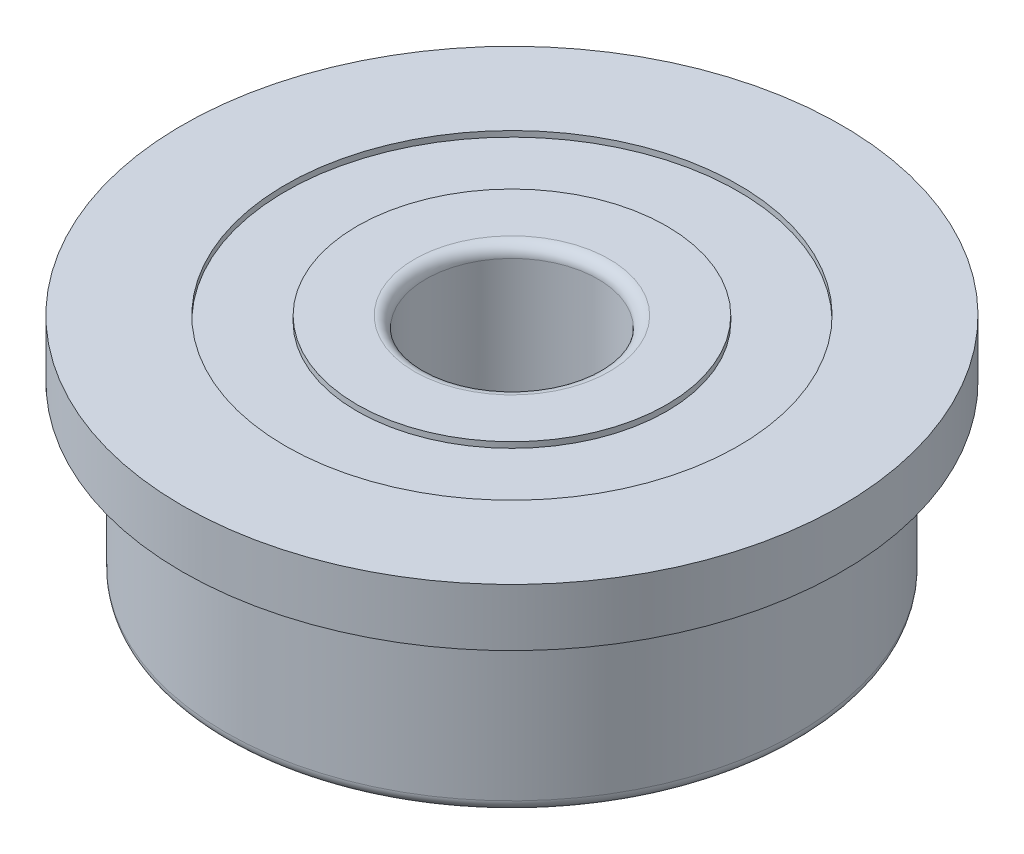
ISO-10303-21;
HEADER;
FILE_DESCRIPTION(('STEP AP214'),'2;1');
FILE_NAME('part.step','',(''),(''),'','','');
FILE_SCHEMA(('AUTOMOTIVE_DESIGN { 1 0 10303 214 1 1 1 1 }'));
ENDSEC;
DATA;
#1=APPLICATION_CONTEXT('core data for automotive mechanical design processes');
#2=APPLICATION_PROTOCOL_DEFINITION('international standard','automotive_design',2000,#1);
#3=PRODUCT_CONTEXT('',#1,'mechanical');
#4=PRODUCT('Part','Part','',(#3));
#5=PRODUCT_RELATED_PRODUCT_CATEGORY('part','',(#4));
#6=PRODUCT_DEFINITION_FORMATION('','',#4);
#7=PRODUCT_DEFINITION_CONTEXT('part definition',#1,'design');
#8=PRODUCT_DEFINITION('design','',#6,#7);
#9=PRODUCT_DEFINITION_SHAPE('','',#8);
#10=(LENGTH_UNIT() NAMED_UNIT(*) SI_UNIT(.MILLI.,.METRE.));
#11=(NAMED_UNIT(*) PLANE_ANGLE_UNIT() SI_UNIT($,.RADIAN.));
#12=(NAMED_UNIT(*) SI_UNIT($,.STERADIAN.) SOLID_ANGLE_UNIT());
#13=UNCERTAINTY_MEASURE_WITH_UNIT(LENGTH_MEASURE(1.E-05),#10,'distance_accuracy_value','');
#14=(GEOMETRIC_REPRESENTATION_CONTEXT(3) GLOBAL_UNCERTAINTY_ASSIGNED_CONTEXT((#13)) GLOBAL_UNIT_ASSIGNED_CONTEXT((#10,
#11,#12)) REPRESENTATION_CONTEXT('',''));
#15=CARTESIAN_POINT('',(0.,0.,0.));
#16=DIRECTION('',(0.,0.,1.));
#17=DIRECTION('',(1.,0.,0.));
#18=AXIS2_PLACEMENT_3D('',#15,#16,#17);
#19=CARTESIAN_POINT('',(0.,-0.2,0.));
#20=DIRECTION('',(0.,1.,0.));
#21=DIRECTION('',(0.,0.,1.));
#22=AXIS2_PLACEMENT_3D('',#19,#20,#21);
#23=TOROIDAL_SURFACE('',#22,1.7,0.2);
#24=CARTESIAN_POINT('',(0.,-0.2,0.));
#25=DIRECTION('',(0.,1.,0.));
#26=DIRECTION('',(0.,0.,1.));
#27=AXIS2_PLACEMENT_3D('',#24,#25,#26);
#28=CIRCLE('',#27,1.5);
#29=CARTESIAN_POINT('',(0.,-0.2,1.5));
#30=VERTEX_POINT('',#29);
#31=EDGE_CURVE('E398',#30,#30,#28,.T.);
#32=ORIENTED_EDGE('',*,*,#31,.F.);
#33=EDGE_LOOP('',(#32));
#34=FACE_BOUND('',#33,.T.);
#35=CARTESIAN_POINT('',(0.,0.,0.));
#36=DIRECTION('',(0.,-1.,0.));
#37=DIRECTION('',(0.,0.,1.));
#38=AXIS2_PLACEMENT_3D('',#35,#36,#37);
#39=CIRCLE('',#38,1.7);
#40=CARTESIAN_POINT('',(0.,0.,1.7));
#41=VERTEX_POINT('',#40);
#42=EDGE_CURVE('E410',#41,#41,#39,.T.);
#43=ORIENTED_EDGE('',*,*,#42,.F.);
#44=EDGE_LOOP('',(#43));
#45=FACE_BOUND('',#44,.T.);
#46=ADVANCED_FACE('F16',(#34,#45),#23,.T.);
#47=CARTESIAN_POINT('',(0.,-3.8,0.));
#48=DIRECTION('',(0.,-1.,0.));
#49=DIRECTION('',(0.,0.,-1.));
#50=AXIS2_PLACEMENT_3D('',#47,#48,#49);
#51=TOROIDAL_SURFACE('',#50,1.7,0.2);
#52=CARTESIAN_POINT('',(0.,-4.,0.));
#53=DIRECTION('',(0.,1.,0.));
#54=DIRECTION('',(0.,0.,-1.));
#55=AXIS2_PLACEMENT_3D('',#52,#53,#54);
#56=CIRCLE('',#55,1.7);
#57=CARTESIAN_POINT('',(0.,-4.,-1.7));
#58=VERTEX_POINT('',#57);
#59=EDGE_CURVE('E11',#58,#58,#56,.T.);
#60=ORIENTED_EDGE('',*,*,#59,.F.);
#61=EDGE_LOOP('',(#60));
#62=FACE_BOUND('',#61,.T.);
#63=CARTESIAN_POINT('',(0.,-3.8,0.));
#64=DIRECTION('',(0.,-1.,0.));
#65=DIRECTION('',(0.,0.,-1.));
#66=AXIS2_PLACEMENT_3D('',#63,#64,#65);
#67=CIRCLE('',#66,1.5);
#68=CARTESIAN_POINT('',(0.,-3.8,-1.5));
#69=VERTEX_POINT('',#68);
#70=EDGE_CURVE('E402',#69,#69,#67,.T.);
#71=ORIENTED_EDGE('',*,*,#70,.F.);
#72=EDGE_LOOP('',(#71));
#73=FACE_BOUND('',#72,.T.);
#74=ADVANCED_FACE('F132',(#62,#73),#51,.T.);
#75=CARTESIAN_POINT('',(0.,-3.8,0.));
#76=DIRECTION('',(0.,-1.,0.));
#77=DIRECTION('',(0.,0.,-1.));
#78=AXIS2_PLACEMENT_3D('',#75,#76,#77);
#79=TOROIDAL_SURFACE('',#78,4.8,0.2);
#80=CARTESIAN_POINT('',(0.,-3.8,0.));
#81=DIRECTION('',(0.,1.,0.));
#82=DIRECTION('',(0.,0.,-1.));
#83=AXIS2_PLACEMENT_3D('',#80,#81,#82);
#84=CIRCLE('',#83,5.);
#85=CARTESIAN_POINT('',(0.,-3.8,-5.));
#86=VERTEX_POINT('',#85);
#87=EDGE_CURVE('E108',#86,#86,#84,.T.);
#88=ORIENTED_EDGE('',*,*,#87,.F.);
#89=EDGE_LOOP('',(#88));
#90=FACE_BOUND('',#89,.T.);
#91=CARTESIAN_POINT('',(0.,-4.,0.));
#92=DIRECTION('',(0.,-1.,0.));
#93=DIRECTION('',(0.,0.,-1.));
#94=AXIS2_PLACEMENT_3D('',#91,#92,#93);
#95=CIRCLE('',#94,4.8);
#96=CARTESIAN_POINT('',(0.,-4.,-4.8));
#97=VERTEX_POINT('',#96);
#98=EDGE_CURVE('E99',#97,#97,#95,.T.);
#99=ORIENTED_EDGE('',*,*,#98,.F.);
#100=EDGE_LOOP('',(#99));
#101=FACE_BOUND('',#100,.T.);
#102=ADVANCED_FACE('F143',(#90,#101),#79,.T.);
#103=CARTESIAN_POINT('',(0.,-4.,2.1));
#104=DIRECTION('',(0.,-1.,0.));
#105=DIRECTION('',(0.,0.,-1.));
#106=AXIS2_PLACEMENT_3D('',#103,#104,#105);
#107=PLANE('',#106);
#108=CARTESIAN_POINT('',(0.,-4.,0.));
#109=DIRECTION('',(0.,1.,0.));
#110=DIRECTION('',(0.,0.,1.));
#111=AXIS2_PLACEMENT_3D('',#108,#109,#110);
#112=CIRCLE('',#111,2.7);
#113=CARTESIAN_POINT('',(0.,-4.,2.7));
#114=VERTEX_POINT('',#113);
#115=EDGE_CURVE('E24',#114,#114,#112,.T.);
#116=ORIENTED_EDGE('',*,*,#115,.F.);
#117=EDGE_LOOP('',(#116));
#118=FACE_BOUND('',#117,.T.);
#119=ORIENTED_EDGE('',*,*,#59,.T.);
#120=EDGE_LOOP('',(#119));
#121=FACE_BOUND('',#120,.T.);
#122=ADVANCED_FACE('F138',(#118,#121),#107,.T.);
#123=CARTESIAN_POINT('',(0.,-2.,0.));
#124=DIRECTION('',(0.,1.,0.));
#125=DIRECTION('',(0.,0.,1.));
#126=AXIS2_PLACEMENT_3D('',#123,#124,#125);
#127=CYLINDRICAL_SURFACE('',#126,2.7);
#128=CARTESIAN_POINT('',(0.,-3.9,0.));
#129=DIRECTION('',(0.,1.,0.));
#130=DIRECTION('',(0.,0.,1.));
#131=AXIS2_PLACEMENT_3D('',#128,#129,#130);
#132=CIRCLE('',#131,2.7);
#133=CARTESIAN_POINT('',(0.,-3.9,2.7));
#134=VERTEX_POINT('',#133);
#135=EDGE_CURVE('E106',#134,#134,#132,.T.);
#136=ORIENTED_EDGE('',*,*,#135,.F.);
#137=EDGE_LOOP('',(#136));
#138=FACE_BOUND('',#137,.T.);
#139=ORIENTED_EDGE('',*,*,#115,.T.);
#140=EDGE_LOOP('',(#139));
#141=FACE_BOUND('',#140,.T.);
#142=ADVANCED_FACE('F142',(#138,#141),#127,.T.);
#143=CARTESIAN_POINT('',(0.,-3.9,3.325));
#144=DIRECTION('',(0.,-1.,0.));
#145=DIRECTION('',(0.,0.,-1.));
#146=AXIS2_PLACEMENT_3D('',#143,#144,#145);
#147=PLANE('',#146);
#148=CARTESIAN_POINT('',(0.,-3.9,0.));
#149=DIRECTION('',(0.,1.,0.));
#150=DIRECTION('',(0.,0.,1.));
#151=AXIS2_PLACEMENT_3D('',#148,#149,#150);
#152=CIRCLE('',#151,3.95);
#153=CARTESIAN_POINT('',(0.,-3.9,3.95));
#154=VERTEX_POINT('',#153);
#155=EDGE_CURVE('E98',#154,#154,#152,.T.);
#156=ORIENTED_EDGE('',*,*,#155,.F.);
#157=EDGE_LOOP('',(#156));
#158=FACE_BOUND('',#157,.T.);
#159=ORIENTED_EDGE('',*,*,#135,.T.);
#160=EDGE_LOOP('',(#159));
#161=FACE_BOUND('',#160,.T.);
#162=ADVANCED_FACE('F151',(#158,#161),#147,.T.);
#163=CARTESIAN_POINT('',(0.,-2.,0.));
#164=DIRECTION('',(0.,1.,0.));
#165=DIRECTION('',(0.,0.,1.));
#166=AXIS2_PLACEMENT_3D('',#163,#164,#165);
#167=CYLINDRICAL_SURFACE('',#166,3.95);
#168=CARTESIAN_POINT('',(0.,-4.,0.));
#169=DIRECTION('',(0.,1.,0.));
#170=DIRECTION('',(0.,0.,1.));
#171=AXIS2_PLACEMENT_3D('',#168,#169,#170);
#172=CIRCLE('',#171,3.95);
#173=CARTESIAN_POINT('',(0.,-4.,3.95));
#174=VERTEX_POINT('',#173);
#175=EDGE_CURVE('E93',#174,#174,#172,.T.);
#176=ORIENTED_EDGE('',*,*,#175,.F.);
#177=EDGE_LOOP('',(#176));
#178=FACE_BOUND('',#177,.T.);
#179=ORIENTED_EDGE('',*,*,#155,.T.);
#180=EDGE_LOOP('',(#179));
#181=FACE_BOUND('',#180,.T.);
#182=ADVANCED_FACE('F169',(#178,#181),#167,.F.);
#183=CARTESIAN_POINT('',(0.,-4.,4.475));
#184=DIRECTION('',(0.,-1.,0.));
#185=DIRECTION('',(0.,0.,-1.));
#186=AXIS2_PLACEMENT_3D('',#183,#184,#185);
#187=PLANE('',#186);
#188=ORIENTED_EDGE('',*,*,#175,.T.);
#189=EDGE_LOOP('',(#188));
#190=FACE_BOUND('',#189,.T.);
#191=ORIENTED_EDGE('',*,*,#98,.T.);
#192=EDGE_LOOP('',(#191));
#193=FACE_BOUND('',#192,.T.);
#194=ADVANCED_FACE('F94',(#190,#193),#187,.T.);
#195=CARTESIAN_POINT('',(0.,-2.,0.));
#196=DIRECTION('',(0.,1.,0.));
#197=DIRECTION('',(0.,0.,1.));
#198=AXIS2_PLACEMENT_3D('',#195,#196,#197);
#199=CYLINDRICAL_SURFACE('',#198,5.);
#200=CARTESIAN_POINT('',(0.,-1.,0.));
#201=DIRECTION('',(0.,1.,0.));
#202=DIRECTION('',(0.,0.,1.));
#203=AXIS2_PLACEMENT_3D('',#200,#201,#202);
#204=CIRCLE('',#203,5.);
#205=CARTESIAN_POINT('',(0.,-1.,5.));
#206=VERTEX_POINT('',#205);
#207=EDGE_CURVE('E434',#206,#206,#204,.T.);
#208=ORIENTED_EDGE('',*,*,#207,.F.);
#209=EDGE_LOOP('',(#208));
#210=FACE_BOUND('',#209,.T.);
#211=ORIENTED_EDGE('',*,*,#87,.T.);
#212=EDGE_LOOP('',(#211));
#213=FACE_BOUND('',#212,.T.);
#214=ADVANCED_FACE('F168',(#210,#213),#199,.T.);
#215=CARTESIAN_POINT('',(0.,-1.,5.375));
#216=DIRECTION('',(0.,-1.,0.));
#217=DIRECTION('',(0.,0.,-1.));
#218=AXIS2_PLACEMENT_3D('',#215,#216,#217);
#219=PLANE('',#218);
#220=CARTESIAN_POINT('',(0.,-1.,0.));
#221=DIRECTION('',(0.,1.,0.));
#222=DIRECTION('',(0.,0.,1.));
#223=AXIS2_PLACEMENT_3D('',#220,#221,#222);
#224=CIRCLE('',#223,5.75);
#225=CARTESIAN_POINT('',(0.,-1.,5.75));
#226=VERTEX_POINT('',#225);
#227=EDGE_CURVE('E430',#226,#226,#224,.T.);
#228=ORIENTED_EDGE('',*,*,#227,.F.);
#229=EDGE_LOOP('',(#228));
#230=FACE_BOUND('',#229,.T.);
#231=ORIENTED_EDGE('',*,*,#207,.T.);
#232=EDGE_LOOP('',(#231));
#233=FACE_BOUND('',#232,.T.);
#234=ADVANCED_FACE('F184',(#230,#233),#219,.T.);
#235=CARTESIAN_POINT('',(0.,-2.,0.));
#236=DIRECTION('',(0.,1.,0.));
#237=DIRECTION('',(0.,0.,1.));
#238=AXIS2_PLACEMENT_3D('',#235,#236,#237);
#239=CYLINDRICAL_SURFACE('',#238,5.75);
#240=CARTESIAN_POINT('',(0.,0.,0.));
#241=DIRECTION('',(0.,1.,0.));
#242=DIRECTION('',(0.,0.,1.));
#243=AXIS2_PLACEMENT_3D('',#240,#241,#242);
#244=CIRCLE('',#243,5.75);
#245=CARTESIAN_POINT('',(0.,0.,5.75));
#246=VERTEX_POINT('',#245);
#247=EDGE_CURVE('E427',#246,#246,#244,.T.);
#248=ORIENTED_EDGE('',*,*,#247,.F.);
#249=EDGE_LOOP('',(#248));
#250=FACE_BOUND('',#249,.T.);
#251=ORIENTED_EDGE('',*,*,#227,.T.);
#252=EDGE_LOOP('',(#251));
#253=FACE_BOUND('',#252,.T.);
#254=ADVANCED_FACE('F193',(#250,#253),#239,.T.);
#255=CARTESIAN_POINT('',(0.,0.,4.85));
#256=DIRECTION('',(0.,1.,0.));
#257=DIRECTION('',(1.,0.,0.));
#258=AXIS2_PLACEMENT_3D('',#255,#256,#257);
#259=PLANE('',#258);
#260=CARTESIAN_POINT('',(0.,0.,0.));
#261=DIRECTION('',(0.,1.,0.));
#262=DIRECTION('',(0.,0.,1.));
#263=AXIS2_PLACEMENT_3D('',#260,#261,#262);
#264=CIRCLE('',#263,3.95);
#265=CARTESIAN_POINT('',(0.,0.,3.95));
#266=VERTEX_POINT('',#265);
#267=EDGE_CURVE('E419',#266,#266,#264,.T.);
#268=ORIENTED_EDGE('',*,*,#267,.F.);
#269=EDGE_LOOP('',(#268));
#270=FACE_BOUND('',#269,.T.);
#271=ORIENTED_EDGE('',*,*,#247,.T.);
#272=EDGE_LOOP('',(#271));
#273=FACE_BOUND('',#272,.T.);
#274=ADVANCED_FACE('F202',(#270,#273),#259,.T.);
#275=CARTESIAN_POINT('',(0.,-2.,0.));
#276=DIRECTION('',(0.,1.,0.));
#277=DIRECTION('',(0.,0.,1.));
#278=AXIS2_PLACEMENT_3D('',#275,#276,#277);
#279=CYLINDRICAL_SURFACE('',#278,3.95);
#280=CARTESIAN_POINT('',(0.,-0.1,0.));
#281=DIRECTION('',(0.,1.,0.));
#282=DIRECTION('',(0.,0.,1.));
#283=AXIS2_PLACEMENT_3D('',#280,#281,#282);
#284=CIRCLE('',#283,3.95);
#285=CARTESIAN_POINT('',(0.,-0.1,3.95));
#286=VERTEX_POINT('',#285);
#287=EDGE_CURVE('E416',#286,#286,#284,.T.);
#288=ORIENTED_EDGE('',*,*,#287,.F.);
#289=EDGE_LOOP('',(#288));
#290=FACE_BOUND('',#289,.T.);
#291=ORIENTED_EDGE('',*,*,#267,.T.);
#292=EDGE_LOOP('',(#291));
#293=FACE_BOUND('',#292,.T.);
#294=ADVANCED_FACE('F211',(#290,#293),#279,.F.);
#295=CARTESIAN_POINT('',(0.,-0.1,3.325));
#296=DIRECTION('',(0.,1.,0.));
#297=DIRECTION('',(1.,0.,0.));
#298=AXIS2_PLACEMENT_3D('',#295,#296,#297);
#299=PLANE('',#298);
#300=CARTESIAN_POINT('',(0.,-0.1,0.));
#301=DIRECTION('',(0.,1.,0.));
#302=DIRECTION('',(0.,0.,1.));
#303=AXIS2_PLACEMENT_3D('',#300,#301,#302);
#304=CIRCLE('',#303,2.7);
#305=CARTESIAN_POINT('',(0.,-0.1,2.7));
#306=VERTEX_POINT('',#305);
#307=EDGE_CURVE('E420',#306,#306,#304,.T.);
#308=ORIENTED_EDGE('',*,*,#307,.F.);
#309=EDGE_LOOP('',(#308));
#310=FACE_BOUND('',#309,.T.);
#311=ORIENTED_EDGE('',*,*,#287,.T.);
#312=EDGE_LOOP('',(#311));
#313=FACE_BOUND('',#312,.T.);
#314=ADVANCED_FACE('F220',(#310,#313),#299,.T.);
#315=CARTESIAN_POINT('',(0.,-2.,0.));
#316=DIRECTION('',(0.,1.,0.));
#317=DIRECTION('',(0.,0.,1.));
#318=AXIS2_PLACEMENT_3D('',#315,#316,#317);
#319=CYLINDRICAL_SURFACE('',#318,2.7);
#320=CARTESIAN_POINT('',(0.,0.,0.));
#321=DIRECTION('',(0.,1.,0.));
#322=DIRECTION('',(0.,0.,1.));
#323=AXIS2_PLACEMENT_3D('',#320,#321,#322);
#324=CIRCLE('',#323,2.7);
#325=CARTESIAN_POINT('',(0.,0.,2.7));
#326=VERTEX_POINT('',#325);
#327=EDGE_CURVE('E415',#326,#326,#324,.T.);
#328=ORIENTED_EDGE('',*,*,#327,.F.);
#329=EDGE_LOOP('',(#328));
#330=FACE_BOUND('',#329,.T.);
#331=ORIENTED_EDGE('',*,*,#307,.T.);
#332=EDGE_LOOP('',(#331));
#333=FACE_BOUND('',#332,.T.);
#334=ADVANCED_FACE('F237',(#330,#333),#319,.T.);
#335=CARTESIAN_POINT('',(0.,0.,2.1));
#336=DIRECTION('',(0.,1.,0.));
#337=DIRECTION('',(1.,0.,0.));
#338=AXIS2_PLACEMENT_3D('',#335,#336,#337);
#339=PLANE('',#338);
#340=ORIENTED_EDGE('',*,*,#327,.T.);
#341=EDGE_LOOP('',(#340));
#342=FACE_BOUND('',#341,.T.);
#343=ORIENTED_EDGE('',*,*,#42,.T.);
#344=EDGE_LOOP('',(#343));
#345=FACE_BOUND('',#344,.T.);
#346=ADVANCED_FACE('F246',(#342,#345),#339,.T.);
#347=CARTESIAN_POINT('',(0.,-2.,0.));
#348=DIRECTION('',(0.,1.,0.));
#349=DIRECTION('',(0.,0.,1.));
#350=AXIS2_PLACEMENT_3D('',#347,#348,#349);
#351=CYLINDRICAL_SURFACE('',#350,1.5);
#352=ORIENTED_EDGE('',*,*,#31,.T.);
#353=EDGE_LOOP('',(#352));
#354=FACE_BOUND('',#353,.T.);
#355=ORIENTED_EDGE('',*,*,#70,.T.);
#356=EDGE_LOOP('',(#355));
#357=FACE_BOUND('',#356,.T.);
#358=ADVANCED_FACE('F263',(#354,#357),#351,.F.);
#359=CLOSED_SHELL('',(#46,#74,#102,#122,#142,#162,#182,#194,#214,#234,#254,#274,#294,#314,#334,
#346,#358));
#360=MANIFOLD_SOLID_BREP('B1',#359);
#361=ADVANCED_BREP_SHAPE_REPRESENTATION('',(#18,#360),#14);
#362=SHAPE_DEFINITION_REPRESENTATION(#9,#361);
ENDSEC;
END-ISO-10303-21;
